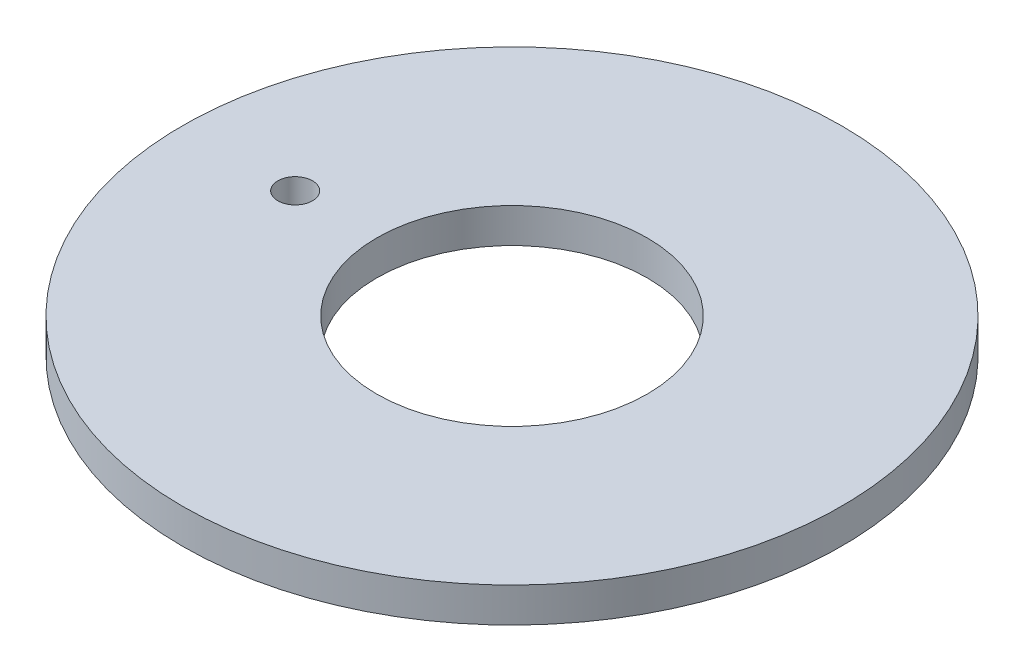
ISO-10303-21;
HEADER;
FILE_DESCRIPTION(('STEP AP214'),'2;1');
FILE_NAME('part.step','',(''),(''),'','','');
FILE_SCHEMA(('AUTOMOTIVE_DESIGN { 1 0 10303 214 1 1 1 1 }'));
ENDSEC;
DATA;
#1=APPLICATION_CONTEXT('core data for automotive mechanical design processes');
#2=APPLICATION_PROTOCOL_DEFINITION('international standard','automotive_design',2000,#1);
#3=PRODUCT_CONTEXT('',#1,'mechanical');
#4=PRODUCT('Part','Part','',(#3));
#5=PRODUCT_RELATED_PRODUCT_CATEGORY('part','',(#4));
#6=PRODUCT_DEFINITION_FORMATION('','',#4);
#7=PRODUCT_DEFINITION_CONTEXT('part definition',#1,'design');
#8=PRODUCT_DEFINITION('design','',#6,#7);
#9=PRODUCT_DEFINITION_SHAPE('','',#8);
#10=(LENGTH_UNIT() NAMED_UNIT(*) SI_UNIT(.MILLI.,.METRE.));
#11=(NAMED_UNIT(*) PLANE_ANGLE_UNIT() SI_UNIT($,.RADIAN.));
#12=(NAMED_UNIT(*) SI_UNIT($,.STERADIAN.) SOLID_ANGLE_UNIT());
#13=UNCERTAINTY_MEASURE_WITH_UNIT(LENGTH_MEASURE(1.E-05),#10,'distance_accuracy_value','');
#14=(GEOMETRIC_REPRESENTATION_CONTEXT(3) GLOBAL_UNCERTAINTY_ASSIGNED_CONTEXT((#13)) GLOBAL_UNIT_ASSIGNED_CONTEXT((#10,
#11,#12)) REPRESENTATION_CONTEXT('',''));
#15=CARTESIAN_POINT('',(0.,0.,0.));
#16=DIRECTION('',(0.,0.,1.));
#17=DIRECTION('',(1.,0.,0.));
#18=AXIS2_PLACEMENT_3D('',#15,#16,#17);
#19=CARTESIAN_POINT('',(0.,4.,0.));
#20=DIRECTION('',(0.,1.,0.));
#21=DIRECTION('',(0.,0.,1.));
#22=AXIS2_PLACEMENT_3D('',#19,#20,#21);
#23=PLANE('',#22);
#24=CARTESIAN_POINT('',(-25.,4.,0.));
#25=DIRECTION('',(0.,1.,0.));
#26=DIRECTION('',(0.,0.,1.));
#27=AXIS2_PLACEMENT_3D('',#24,#25,#26);
#28=CIRCLE('',#27,2.);
#29=CARTESIAN_POINT('',(-25.,4.,2.));
#30=VERTEX_POINT('',#29);
#31=EDGE_CURVE('E59',#30,#30,#28,.T.);
#32=ORIENTED_EDGE('',*,*,#31,.F.);
#33=EDGE_LOOP('',(#32));
#34=FACE_BOUND('',#33,.T.);
#35=CARTESIAN_POINT('',(0.,4.,0.));
#36=DIRECTION('',(0.,1.,0.));
#37=DIRECTION('',(0.,0.,1.));
#38=AXIS2_PLACEMENT_3D('',#35,#36,#37);
#39=CIRCLE('',#38,38.);
#40=CARTESIAN_POINT('',(0.,4.,38.));
#41=VERTEX_POINT('',#40);
#42=EDGE_CURVE('E10',#41,#41,#39,.T.);
#43=ORIENTED_EDGE('',*,*,#42,.T.);
#44=EDGE_LOOP('',(#43));
#45=FACE_BOUND('',#44,.T.);
#46=CARTESIAN_POINT('',(0.,4.,0.));
#47=DIRECTION('',(0.,1.,0.));
#48=DIRECTION('',(0.,0.,1.));
#49=AXIS2_PLACEMENT_3D('',#46,#47,#48);
#50=CIRCLE('',#49,15.6);
#51=CARTESIAN_POINT('',(0.,4.,15.6));
#52=VERTEX_POINT('',#51);
#53=EDGE_CURVE('E50',#52,#52,#50,.T.);
#54=ORIENTED_EDGE('',*,*,#53,.F.);
#55=EDGE_LOOP('',(#54));
#56=FACE_BOUND('',#55,.T.);
#57=ADVANCED_FACE('F36',(#34,#45,#56),#23,.T.);
#58=CARTESIAN_POINT('',(0.,0.,0.));
#59=DIRECTION('',(0.,1.,0.));
#60=DIRECTION('',(0.,0.,1.));
#61=AXIS2_PLACEMENT_3D('',#58,#59,#60);
#62=PLANE('',#61);
#63=CARTESIAN_POINT('',(-25.,0.,0.));
#64=DIRECTION('',(0.,1.,0.));
#65=DIRECTION('',(0.,0.,1.));
#66=AXIS2_PLACEMENT_3D('',#63,#64,#65);
#67=CIRCLE('',#66,2.);
#68=CARTESIAN_POINT('',(-25.,0.,2.));
#69=VERTEX_POINT('',#68);
#70=EDGE_CURVE('E55',#69,#69,#67,.T.);
#71=ORIENTED_EDGE('',*,*,#70,.T.);
#72=EDGE_LOOP('',(#71));
#73=FACE_BOUND('',#72,.T.);
#74=CARTESIAN_POINT('',(0.,0.,0.));
#75=DIRECTION('',(0.,1.,0.));
#76=DIRECTION('',(0.,0.,1.));
#77=AXIS2_PLACEMENT_3D('',#74,#75,#76);
#78=CIRCLE('',#77,38.);
#79=CARTESIAN_POINT('',(0.,0.,38.));
#80=VERTEX_POINT('',#79);
#81=EDGE_CURVE('E40',#80,#80,#78,.T.);
#82=ORIENTED_EDGE('',*,*,#81,.F.);
#83=EDGE_LOOP('',(#82));
#84=FACE_BOUND('',#83,.T.);
#85=CARTESIAN_POINT('',(0.,0.,0.));
#86=DIRECTION('',(0.,1.,0.));
#87=DIRECTION('',(0.,0.,1.));
#88=AXIS2_PLACEMENT_3D('',#85,#86,#87);
#89=CIRCLE('',#88,15.6);
#90=CARTESIAN_POINT('',(0.,0.,15.6));
#91=VERTEX_POINT('',#90);
#92=EDGE_CURVE('E52',#91,#91,#89,.T.);
#93=ORIENTED_EDGE('',*,*,#92,.T.);
#94=EDGE_LOOP('',(#93));
#95=FACE_BOUND('',#94,.T.);
#96=ADVANCED_FACE('F67',(#73,#84,#95),#62,.F.);
#97=CARTESIAN_POINT('',(0.,4.,0.));
#98=DIRECTION('',(0.,-1.,0.));
#99=DIRECTION('',(0.,0.,-1.));
#100=AXIS2_PLACEMENT_3D('',#97,#98,#99);
#101=CYLINDRICAL_SURFACE('',#100,38.);
#102=ORIENTED_EDGE('',*,*,#42,.F.);
#103=EDGE_LOOP('',(#102));
#104=FACE_BOUND('',#103,.T.);
#105=ORIENTED_EDGE('',*,*,#81,.T.);
#106=EDGE_LOOP('',(#105));
#107=FACE_BOUND('',#106,.T.);
#108=ADVANCED_FACE('F38',(#104,#107),#101,.T.);
#109=CARTESIAN_POINT('',(0.,4.,0.));
#110=DIRECTION('',(0.,-1.,0.));
#111=DIRECTION('',(0.,0.,-1.));
#112=AXIS2_PLACEMENT_3D('',#109,#110,#111);
#113=CYLINDRICAL_SURFACE('',#112,15.6);
#114=ORIENTED_EDGE('',*,*,#53,.T.);
#115=EDGE_LOOP('',(#114));
#116=FACE_BOUND('',#115,.T.);
#117=ORIENTED_EDGE('',*,*,#92,.F.);
#118=EDGE_LOOP('',(#117));
#119=FACE_BOUND('',#118,.T.);
#120=ADVANCED_FACE('F73',(#116,#119),#113,.F.);
#121=CARTESIAN_POINT('',(-25.,0.,0.));
#122=DIRECTION('',(0.,1.,0.));
#123=DIRECTION('',(0.,0.,1.));
#124=AXIS2_PLACEMENT_3D('',#121,#122,#123);
#125=CYLINDRICAL_SURFACE('',#124,2.);
#126=ORIENTED_EDGE('',*,*,#70,.F.);
#127=EDGE_LOOP('',(#126));
#128=FACE_BOUND('',#127,.T.);
#129=ORIENTED_EDGE('',*,*,#31,.T.);
#130=EDGE_LOOP('',(#129));
#131=FACE_BOUND('',#130,.T.);
#132=ADVANCED_FACE('F70',(#128,#131),#125,.F.);
#133=CLOSED_SHELL('',(#57,#96,#108,#120,#132));
#134=MANIFOLD_SOLID_BREP('B2',#133);
#135=ADVANCED_BREP_SHAPE_REPRESENTATION('',(#18,#134),#14);
#136=SHAPE_DEFINITION_REPRESENTATION(#9,#135);
ENDSEC;
END-ISO-10303-21;
